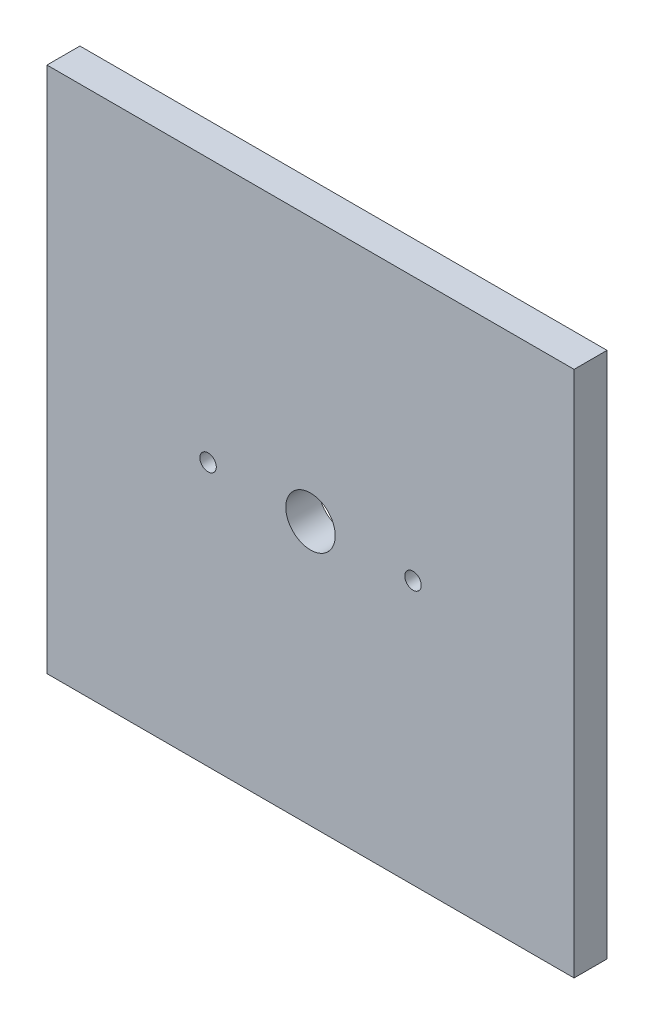
ISO-10303-21;
HEADER;
FILE_DESCRIPTION(('STEP AP214'),'2;1');
FILE_NAME('part.step','',(''),(''),'','','');
FILE_SCHEMA(('AUTOMOTIVE_DESIGN { 1 0 10303 214 1 1 1 1 }'));
ENDSEC;
DATA;
#1=APPLICATION_CONTEXT('core data for automotive mechanical design processes');
#2=APPLICATION_PROTOCOL_DEFINITION('international standard','automotive_design',2000,#1);
#3=PRODUCT_CONTEXT('',#1,'mechanical');
#4=PRODUCT('Part','Part','',(#3));
#5=PRODUCT_RELATED_PRODUCT_CATEGORY('part','',(#4));
#6=PRODUCT_DEFINITION_FORMATION('','',#4);
#7=PRODUCT_DEFINITION_CONTEXT('part definition',#1,'design');
#8=PRODUCT_DEFINITION('design','',#6,#7);
#9=PRODUCT_DEFINITION_SHAPE('','',#8);
#10=(LENGTH_UNIT() NAMED_UNIT(*) SI_UNIT(.MILLI.,.METRE.));
#11=(NAMED_UNIT(*) PLANE_ANGLE_UNIT() SI_UNIT($,.RADIAN.));
#12=(NAMED_UNIT(*) SI_UNIT($,.STERADIAN.) SOLID_ANGLE_UNIT());
#13=UNCERTAINTY_MEASURE_WITH_UNIT(LENGTH_MEASURE(1.E-05),#10,'distance_accuracy_value','');
#14=(GEOMETRIC_REPRESENTATION_CONTEXT(3) GLOBAL_UNCERTAINTY_ASSIGNED_CONTEXT((#13)) GLOBAL_UNIT_ASSIGNED_CONTEXT((#10,
#11,#12)) REPRESENTATION_CONTEXT('',''));
#15=CARTESIAN_POINT('',(0.,0.,0.));
#16=DIRECTION('',(0.,0.,1.));
#17=DIRECTION('',(1.,0.,0.));
#18=AXIS2_PLACEMENT_3D('',#15,#16,#17);
#19=CARTESIAN_POINT('',(101.6,101.6,12.7));
#20=DIRECTION('',(-0.999999999999996,0.,0.));
#21=DIRECTION('',(0.,-0.999999999999996,0.));
#22=AXIS2_PLACEMENT_3D('',#19,#20,#21);
#23=PLANE('',#22);
#24=DIRECTION('',(0.,0.999999999999996,0.));
#25=VECTOR('',#24,1.);
#26=CARTESIAN_POINT('',(101.6,101.6,0.));
#27=LINE('',#26,#25);
#28=CARTESIAN_POINT('',(101.6,-101.6,0.));
#29=VERTEX_POINT('',#28);
#30=CARTESIAN_POINT('',(101.6,101.6,0.));
#31=VERTEX_POINT('',#30);
#32=EDGE_CURVE('E103',#29,#31,#27,.T.);
#33=ORIENTED_EDGE('',*,*,#32,.T.);
#34=DIRECTION('',(0.,0.,-0.999999999999989));
#35=VECTOR('',#34,1.);
#36=CARTESIAN_POINT('',(101.6,101.6,12.7));
#37=LINE('',#36,#35);
#38=CARTESIAN_POINT('',(101.6,101.6,12.7));
#39=VERTEX_POINT('',#38);
#40=EDGE_CURVE('E11',#39,#31,#37,.T.);
#41=ORIENTED_EDGE('',*,*,#40,.F.);
#42=DIRECTION('',(0.,0.999999999999996,0.));
#43=VECTOR('',#42,1.);
#44=CARTESIAN_POINT('',(101.6,101.6,12.7));
#45=LINE('',#44,#43);
#46=CARTESIAN_POINT('',(101.6,-101.6,12.7));
#47=VERTEX_POINT('',#46);
#48=EDGE_CURVE('E91',#47,#39,#45,.T.);
#49=ORIENTED_EDGE('',*,*,#48,.F.);
#50=DIRECTION('',(0.,0.,-0.999999999999989));
#51=VECTOR('',#50,1.);
#52=CARTESIAN_POINT('',(101.6,-101.6,12.7));
#53=LINE('',#52,#51);
#54=EDGE_CURVE('E99',#47,#29,#53,.T.);
#55=ORIENTED_EDGE('',*,*,#54,.T.);
#56=EDGE_LOOP('',(#33,#41,#49,#55));
#57=FACE_BOUND('',#56,.T.);
#58=ADVANCED_FACE('F40',(#57),#23,.F.);
#59=CARTESIAN_POINT('',(-101.6,101.6,12.7000000000001));
#60=DIRECTION('',(0.,-0.999999999999996,0.));
#61=DIRECTION('',(0.,0.,-0.999999999999989));
#62=AXIS2_PLACEMENT_3D('',#59,#60,#61);
#63=PLANE('',#62);
#64=DIRECTION('',(-0.999999999999996,0.,0.));
#65=VECTOR('',#64,1.);
#66=CARTESIAN_POINT('',(-101.6,101.6,7.21644966006352E-13));
#67=LINE('',#66,#65);
#68=CARTESIAN_POINT('',(-101.6,101.6,7.21644966006352E-13));
#69=VERTEX_POINT('',#68);
#70=EDGE_CURVE('E95',#31,#69,#67,.T.);
#71=ORIENTED_EDGE('',*,*,#70,.T.);
#72=DIRECTION('',(0.,0.,-0.999999999999989));
#73=VECTOR('',#72,1.);
#74=CARTESIAN_POINT('',(-101.6,101.6,12.7000000000001));
#75=LINE('',#74,#73);
#76=CARTESIAN_POINT('',(-101.6,101.6,12.7000000000001));
#77=VERTEX_POINT('',#76);
#78=EDGE_CURVE('E48',#77,#69,#75,.T.);
#79=ORIENTED_EDGE('',*,*,#78,.F.);
#80=DIRECTION('',(-0.999999999999996,0.,0.));
#81=VECTOR('',#80,1.);
#82=CARTESIAN_POINT('',(-101.6,101.6,12.7000000000001));
#83=LINE('',#82,#81);
#84=EDGE_CURVE('E86',#39,#77,#83,.T.);
#85=ORIENTED_EDGE('',*,*,#84,.F.);
#86=ORIENTED_EDGE('',*,*,#40,.T.);
#87=EDGE_LOOP('',(#71,#79,#85,#86));
#88=FACE_BOUND('',#87,.T.);
#89=ADVANCED_FACE('F94',(#88),#63,.F.);
#90=CARTESIAN_POINT('',(-101.6,101.6,12.7000000000001));
#91=DIRECTION('',(0.999999999999996,0.,0.));
#92=DIRECTION('',(0.,0.999999999999996,0.));
#93=AXIS2_PLACEMENT_3D('',#90,#91,#92);
#94=PLANE('',#93);
#95=DIRECTION('',(0.,-0.999999999999996,0.));
#96=VECTOR('',#95,1.);
#97=CARTESIAN_POINT('',(-101.6,101.6,7.21644966006352E-13));
#98=LINE('',#97,#96);
#99=CARTESIAN_POINT('',(-101.6,-101.6,2.77555756156289E-13));
#100=VERTEX_POINT('',#99);
#101=EDGE_CURVE('E73',#69,#100,#98,.T.);
#102=ORIENTED_EDGE('',*,*,#101,.T.);
#103=DIRECTION('',(0.,0.,-0.999999999999989));
#104=VECTOR('',#103,1.);
#105=CARTESIAN_POINT('',(-101.6,-101.6,12.7));
#106=LINE('',#105,#104);
#107=CARTESIAN_POINT('',(-101.6,-101.6,12.7));
#108=VERTEX_POINT('',#107);
#109=EDGE_CURVE('E96',#108,#100,#106,.T.);
#110=ORIENTED_EDGE('',*,*,#109,.F.);
#111=DIRECTION('',(0.,-0.999999999999996,0.));
#112=VECTOR('',#111,1.);
#113=CARTESIAN_POINT('',(-101.6,101.6,12.7000000000001));
#114=LINE('',#113,#112);
#115=EDGE_CURVE('E89',#77,#108,#114,.T.);
#116=ORIENTED_EDGE('',*,*,#115,.F.);
#117=ORIENTED_EDGE('',*,*,#78,.T.);
#118=EDGE_LOOP('',(#102,#110,#116,#117));
#119=FACE_BOUND('',#118,.T.);
#120=ADVANCED_FACE('F97',(#119),#94,.F.);
#121=CARTESIAN_POINT('',(-101.6,-101.6,12.7));
#122=DIRECTION('',(0.,0.999999999999996,0.));
#123=DIRECTION('',(0.,0.,0.999999999999989));
#124=AXIS2_PLACEMENT_3D('',#121,#122,#123);
#125=PLANE('',#124);
#126=DIRECTION('',(0.999999999999996,0.,0.));
#127=VECTOR('',#126,1.);
#128=CARTESIAN_POINT('',(-101.6,-101.6,2.77555756156289E-13));
#129=LINE('',#128,#127);
#130=EDGE_CURVE('E79',#100,#29,#129,.T.);
#131=ORIENTED_EDGE('',*,*,#130,.T.);
#132=ORIENTED_EDGE('',*,*,#54,.F.);
#133=DIRECTION('',(0.999999999999996,0.,0.));
#134=VECTOR('',#133,1.);
#135=CARTESIAN_POINT('',(-101.6,-101.6,12.7));
#136=LINE('',#135,#134);
#137=EDGE_CURVE('E56',#108,#47,#136,.T.);
#138=ORIENTED_EDGE('',*,*,#137,.F.);
#139=ORIENTED_EDGE('',*,*,#109,.T.);
#140=EDGE_LOOP('',(#131,#132,#138,#139));
#141=FACE_BOUND('',#140,.T.);
#142=ADVANCED_FACE('F111',(#141),#125,.F.);
#143=CARTESIAN_POINT('',(0.,0.,12.7));
#144=DIRECTION('',(0.,0.,0.999999999999989));
#145=DIRECTION('',(0.999999999999996,0.,0.));
#146=AXIS2_PLACEMENT_3D('',#143,#144,#145);
#147=PLANE('',#146);
#148=CARTESIAN_POINT('',(-39.4969999999999,0.,12.7));
#149=DIRECTION('',(0.,0.,0.999999999999989));
#150=DIRECTION('',(0.999999999999996,0.,0.));
#151=AXIS2_PLACEMENT_3D('',#148,#149,#150);
#152=CIRCLE('',#151,3.175);
#153=CARTESIAN_POINT('',(-36.3219999999999,0.,12.7));
#154=VERTEX_POINT('',#153);
#155=EDGE_CURVE('E123',#154,#154,#152,.T.);
#156=ORIENTED_EDGE('',*,*,#155,.F.);
#157=EDGE_LOOP('',(#156));
#158=FACE_BOUND('',#157,.T.);
#159=CARTESIAN_POINT('',(39.4969999999999,0.,12.7));
#160=DIRECTION('',(0.,0.,0.999999999999989));
#161=DIRECTION('',(0.999999999999996,0.,0.));
#162=AXIS2_PLACEMENT_3D('',#159,#160,#161);
#163=CIRCLE('',#162,3.175);
#164=CARTESIAN_POINT('',(42.6719999999999,0.,12.7));
#165=VERTEX_POINT('',#164);
#166=EDGE_CURVE('E129',#165,#165,#163,.T.);
#167=ORIENTED_EDGE('',*,*,#166,.F.);
#168=EDGE_LOOP('',(#167));
#169=FACE_BOUND('',#168,.T.);
#170=CARTESIAN_POINT('',(0.,0.,12.7));
#171=DIRECTION('',(0.,0.,0.999999999999989));
#172=DIRECTION('',(0.999999999999996,0.,0.));
#173=AXIS2_PLACEMENT_3D('',#170,#171,#172);
#174=CIRCLE('',#173,9.525);
#175=CARTESIAN_POINT('',(9.52499999999996,0.,12.7));
#176=VERTEX_POINT('',#175);
#177=EDGE_CURVE('E117',#176,#176,#174,.T.);
#178=ORIENTED_EDGE('',*,*,#177,.F.);
#179=EDGE_LOOP('',(#178));
#180=FACE_BOUND('',#179,.T.);
#181=ORIENTED_EDGE('',*,*,#48,.T.);
#182=ORIENTED_EDGE('',*,*,#84,.T.);
#183=ORIENTED_EDGE('',*,*,#115,.T.);
#184=ORIENTED_EDGE('',*,*,#137,.T.);
#185=EDGE_LOOP('',(#181,#182,#183,#184));
#186=FACE_BOUND('',#185,.T.);
#187=ADVANCED_FACE('F87',(#158,#169,#180,#186),#147,.T.);
#188=CARTESIAN_POINT('',(0.,0.,0.));
#189=DIRECTION('',(0.,0.,0.999999999999989));
#190=DIRECTION('',(0.999999999999996,0.,0.));
#191=AXIS2_PLACEMENT_3D('',#188,#189,#190);
#192=PLANE('',#191);
#193=CARTESIAN_POINT('',(-39.4969999999999,0.,0.));
#194=DIRECTION('',(0.,0.,0.999999999999989));
#195=DIRECTION('',(0.999999999999996,0.,0.));
#196=AXIS2_PLACEMENT_3D('',#193,#194,#195);
#197=CIRCLE('',#196,3.175);
#198=CARTESIAN_POINT('',(-36.3219999999999,0.,0.));
#199=VERTEX_POINT('',#198);
#200=EDGE_CURVE('E126',#199,#199,#197,.T.);
#201=ORIENTED_EDGE('',*,*,#200,.T.);
#202=EDGE_LOOP('',(#201));
#203=FACE_BOUND('',#202,.T.);
#204=CARTESIAN_POINT('',(39.4969999999999,0.,0.));
#205=DIRECTION('',(0.,0.,0.999999999999989));
#206=DIRECTION('',(0.999999999999996,0.,0.));
#207=AXIS2_PLACEMENT_3D('',#204,#205,#206);
#208=CIRCLE('',#207,3.175);
#209=CARTESIAN_POINT('',(42.6719999999999,0.,0.));
#210=VERTEX_POINT('',#209);
#211=EDGE_CURVE('E120',#210,#210,#208,.T.);
#212=ORIENTED_EDGE('',*,*,#211,.T.);
#213=EDGE_LOOP('',(#212));
#214=FACE_BOUND('',#213,.T.);
#215=CARTESIAN_POINT('',(0.,0.,0.));
#216=DIRECTION('',(0.,0.,0.999999999999989));
#217=DIRECTION('',(0.999999999999996,0.,0.));
#218=AXIS2_PLACEMENT_3D('',#215,#216,#217);
#219=CIRCLE('',#218,9.525);
#220=CARTESIAN_POINT('',(9.52499999999996,0.,0.));
#221=VERTEX_POINT('',#220);
#222=EDGE_CURVE('E106',#221,#221,#219,.T.);
#223=ORIENTED_EDGE('',*,*,#222,.T.);
#224=EDGE_LOOP('',(#223));
#225=FACE_BOUND('',#224,.T.);
#226=ORIENTED_EDGE('',*,*,#32,.F.);
#227=ORIENTED_EDGE('',*,*,#130,.F.);
#228=ORIENTED_EDGE('',*,*,#101,.F.);
#229=ORIENTED_EDGE('',*,*,#70,.F.);
#230=EDGE_LOOP('',(#226,#227,#228,#229));
#231=FACE_BOUND('',#230,.T.);
#232=ADVANCED_FACE('F114',(#203,#214,#225,#231),#192,.F.);
#233=CARTESIAN_POINT('',(0.,0.,0.));
#234=DIRECTION('',(0.,0.,0.999999999999989));
#235=DIRECTION('',(0.999999999999996,0.,0.));
#236=AXIS2_PLACEMENT_3D('',#233,#234,#235);
#237=CYLINDRICAL_SURFACE('',#236,9.525);
#238=CARTESIAN_POINT('',(9.52499999999996,0.,0.));
#239=CARTESIAN_POINT('',(9.52499999999996,0.,0.132291666666667));
#240=CARTESIAN_POINT('',(9.52499999999996,0.,0.264583333333333));
#241=CARTESIAN_POINT('',(9.52499999999996,0.,0.529166666666666));
#242=CARTESIAN_POINT('',(9.52499999999996,0.,0.661458333333333));
#243=CARTESIAN_POINT('',(9.52499999999996,0.,0.926041666666666));
#244=CARTESIAN_POINT('',(9.52499999999996,0.,1.05833333333333));
#245=CARTESIAN_POINT('',(9.52499999999996,0.,1.32291666666667));
#246=CARTESIAN_POINT('',(9.52499999999996,0.,1.45520833333333));
#247=CARTESIAN_POINT('',(9.52499999999996,0.,1.71979166666667));
#248=CARTESIAN_POINT('',(9.52499999999996,0.,1.85208333333333));
#249=CARTESIAN_POINT('',(9.52499999999996,0.,2.11666666666666));
#250=CARTESIAN_POINT('',(9.52499999999996,0.,2.24895833333333));
#251=CARTESIAN_POINT('',(9.52499999999996,0.,2.51354166666667));
#252=CARTESIAN_POINT('',(9.52499999999996,0.,2.64583333333333));
#253=CARTESIAN_POINT('',(9.52499999999996,0.,2.91041666666666));
#254=CARTESIAN_POINT('',(9.52499999999996,0.,3.04270833333333));
#255=CARTESIAN_POINT('',(9.52499999999996,0.,3.30729166666666));
#256=CARTESIAN_POINT('',(9.52499999999996,0.,3.43958333333333));
#257=CARTESIAN_POINT('',(9.52499999999996,0.,3.70416666666666));
#258=CARTESIAN_POINT('',(9.52499999999996,0.,3.83645833333333));
#259=CARTESIAN_POINT('',(9.52499999999996,0.,4.10104166666666));
#260=CARTESIAN_POINT('',(9.52499999999996,0.,4.23333333333333));
#261=CARTESIAN_POINT('',(9.52499999999996,0.,4.49791666666666));
#262=CARTESIAN_POINT('',(9.52499999999996,0.,4.63020833333333));
#263=CARTESIAN_POINT('',(9.52499999999996,0.,4.89479166666666));
#264=CARTESIAN_POINT('',(9.52499999999996,0.,5.02708333333333));
#265=CARTESIAN_POINT('',(9.52499999999996,0.,5.29166666666666));
#266=CARTESIAN_POINT('',(9.52499999999996,0.,5.42395833333333));
#267=CARTESIAN_POINT('',(9.52499999999996,0.,5.68854166666666));
#268=CARTESIAN_POINT('',(9.52499999999996,0.,5.82083333333333));
#269=CARTESIAN_POINT('',(9.52499999999996,0.,6.08541666666666));
#270=CARTESIAN_POINT('',(9.52499999999996,0.,6.21770833333333));
#271=CARTESIAN_POINT('',(9.52499999999996,0.,6.48229166666666));
#272=CARTESIAN_POINT('',(9.52499999999996,0.,6.61458333333333));
#273=CARTESIAN_POINT('',(9.52499999999996,0.,6.87916666666666));
#274=CARTESIAN_POINT('',(9.52499999999996,0.,7.01145833333333));
#275=CARTESIAN_POINT('',(9.52499999999996,0.,7.27604166666666));
#276=CARTESIAN_POINT('',(9.52499999999996,0.,7.40833333333333));
#277=CARTESIAN_POINT('',(9.52499999999996,0.,7.67291666666666));
#278=CARTESIAN_POINT('',(9.52499999999996,0.,7.80520833333333));
#279=CARTESIAN_POINT('',(9.52499999999996,0.,8.06979166666666));
#280=CARTESIAN_POINT('',(9.52499999999996,0.,8.20208333333333));
#281=CARTESIAN_POINT('',(9.52499999999996,0.,8.46666666666666));
#282=CARTESIAN_POINT('',(9.52499999999996,0.,8.59895833333333));
#283=CARTESIAN_POINT('',(9.52499999999996,0.,8.86354166666666));
#284=CARTESIAN_POINT('',(9.52499999999996,0.,8.99583333333333));
#285=CARTESIAN_POINT('',(9.52499999999996,0.,9.26041666666666));
#286=CARTESIAN_POINT('',(9.52499999999996,0.,9.39270833333333));
#287=CARTESIAN_POINT('',(9.52499999999996,0.,9.65729166666666));
#288=CARTESIAN_POINT('',(9.52499999999996,0.,9.78958333333333));
#289=CARTESIAN_POINT('',(9.52499999999996,0.,10.0541666666667));
#290=CARTESIAN_POINT('',(9.52499999999996,0.,10.1864583333333));
#291=CARTESIAN_POINT('',(9.52499999999996,0.,10.4510416666667));
#292=CARTESIAN_POINT('',(9.52499999999996,0.,10.5833333333333));
#293=CARTESIAN_POINT('',(9.52499999999996,0.,10.8479166666667));
#294=CARTESIAN_POINT('',(9.52499999999996,0.,10.9802083333333));
#295=CARTESIAN_POINT('',(9.52499999999996,0.,11.2447916666667));
#296=CARTESIAN_POINT('',(9.52499999999996,0.,11.3770833333333));
#297=CARTESIAN_POINT('',(9.52499999999996,0.,11.6416666666667));
#298=CARTESIAN_POINT('',(9.52499999999996,0.,11.7739583333333));
#299=CARTESIAN_POINT('',(9.52499999999996,0.,12.0385416666667));
#300=CARTESIAN_POINT('',(9.52499999999996,0.,12.1708333333333));
#301=CARTESIAN_POINT('',(9.52499999999996,0.,12.4354166666667));
#302=CARTESIAN_POINT('',(9.52499999999996,0.,12.5677083333333));
#303=CARTESIAN_POINT('',(9.52499999999996,0.,12.7));
#304=B_SPLINE_CURVE_WITH_KNOTS('',3,(#238,#239,#240,#241,#242,#243,#244,#245,#246,#247,#248,
#249,#250,#251,#252,#253,#254,#255,#256,#257,#258,#259,#260,#261,#262,#263,#264,#265,#266,#267,
#268,#269,#270,#271,#272,#273,#274,#275,#276,#277,#278,#279,#280,#281,#282,#283,#284,#285,#286,
#287,#288,#289,#290,#291,#292,#293,#294,#295,#296,#297,#298,#299,#300,#301,#302,#303),
.UNSPECIFIED.,.F.,.F.,(4,2,2,2,2,2,2,2,2,2,2,2,2,2,2,2,2,2,2,2,2,2,2,2,2,2,2,2,2,2,2,2,4),(0.,
0.396875,0.793749999999999,1.190625,1.5875,1.984375,2.38125,2.778125,3.175,3.571875,3.96875,
4.365625,4.7625,5.159375,5.55625,5.953125,6.35,6.74687499999999,7.14374999999999,
7.54062499999999,7.93749999999999,8.33437499999999,8.73124999999999,9.12812499999999,
9.52499999999999,9.92187499999999,10.31875,10.715625,11.1125,11.509375,11.90625,12.303125,12.7),.UNSPECIFIED.);
#305=EDGE_CURVE('BSEAM141',#221,#176,#304,.T.);
#306=ORIENTED_EDGE('',*,*,#222,.F.);
#307=ORIENTED_EDGE('',*,*,#177,.T.);
#308=ORIENTED_EDGE('',*,*,#305,.T.);
#309=ORIENTED_EDGE('',*,*,#305,.F.);
#310=EDGE_LOOP('',(#306,#308,#307,#309));
#311=FACE_BOUND('',#310,.T.);
#312=ADVANCED_FACE('F141',(#311),#237,.F.);
#313=CARTESIAN_POINT('',(39.4969999999999,0.,0.));
#314=DIRECTION('',(0.,0.,0.999999999999989));
#315=DIRECTION('',(0.999999999999996,0.,0.));
#316=AXIS2_PLACEMENT_3D('',#313,#314,#315);
#317=CYLINDRICAL_SURFACE('',#316,3.175);
#318=CARTESIAN_POINT('',(42.6719999999999,0.,0.));
#319=CARTESIAN_POINT('',(42.6719999999999,0.,0.132291666666667));
#320=CARTESIAN_POINT('',(42.6719999999999,0.,0.264583333333333));
#321=CARTESIAN_POINT('',(42.6719999999999,0.,0.529166666666666));
#322=CARTESIAN_POINT('',(42.6719999999999,0.,0.661458333333333));
#323=CARTESIAN_POINT('',(42.6719999999999,0.,0.926041666666666));
#324=CARTESIAN_POINT('',(42.6719999999999,0.,1.05833333333333));
#325=CARTESIAN_POINT('',(42.6719999999999,0.,1.32291666666667));
#326=CARTESIAN_POINT('',(42.6719999999999,0.,1.45520833333333));
#327=CARTESIAN_POINT('',(42.6719999999999,0.,1.71979166666667));
#328=CARTESIAN_POINT('',(42.6719999999999,0.,1.85208333333333));
#329=CARTESIAN_POINT('',(42.6719999999999,0.,2.11666666666666));
#330=CARTESIAN_POINT('',(42.6719999999999,0.,2.24895833333333));
#331=CARTESIAN_POINT('',(42.6719999999999,0.,2.51354166666667));
#332=CARTESIAN_POINT('',(42.6719999999999,0.,2.64583333333333));
#333=CARTESIAN_POINT('',(42.6719999999999,0.,2.91041666666666));
#334=CARTESIAN_POINT('',(42.6719999999999,0.,3.04270833333333));
#335=CARTESIAN_POINT('',(42.6719999999999,0.,3.30729166666666));
#336=CARTESIAN_POINT('',(42.6719999999999,0.,3.43958333333333));
#337=CARTESIAN_POINT('',(42.6719999999999,0.,3.70416666666666));
#338=CARTESIAN_POINT('',(42.6719999999999,0.,3.83645833333333));
#339=CARTESIAN_POINT('',(42.6719999999999,0.,4.10104166666666));
#340=CARTESIAN_POINT('',(42.6719999999999,0.,4.23333333333333));
#341=CARTESIAN_POINT('',(42.6719999999999,0.,4.49791666666666));
#342=CARTESIAN_POINT('',(42.6719999999999,0.,4.63020833333333));
#343=CARTESIAN_POINT('',(42.6719999999999,0.,4.89479166666666));
#344=CARTESIAN_POINT('',(42.6719999999999,0.,5.02708333333333));
#345=CARTESIAN_POINT('',(42.6719999999999,0.,5.29166666666666));
#346=CARTESIAN_POINT('',(42.6719999999999,0.,5.42395833333333));
#347=CARTESIAN_POINT('',(42.6719999999999,0.,5.68854166666666));
#348=CARTESIAN_POINT('',(42.6719999999999,0.,5.82083333333333));
#349=CARTESIAN_POINT('',(42.6719999999999,0.,6.08541666666666));
#350=CARTESIAN_POINT('',(42.6719999999999,0.,6.21770833333333));
#351=CARTESIAN_POINT('',(42.6719999999999,0.,6.48229166666666));
#352=CARTESIAN_POINT('',(42.6719999999999,0.,6.61458333333333));
#353=CARTESIAN_POINT('',(42.6719999999999,0.,6.87916666666666));
#354=CARTESIAN_POINT('',(42.6719999999999,0.,7.01145833333333));
#355=CARTESIAN_POINT('',(42.6719999999999,0.,7.27604166666666));
#356=CARTESIAN_POINT('',(42.6719999999999,0.,7.40833333333333));
#357=CARTESIAN_POINT('',(42.6719999999999,0.,7.67291666666666));
#358=CARTESIAN_POINT('',(42.6719999999999,0.,7.80520833333333));
#359=CARTESIAN_POINT('',(42.6719999999999,0.,8.06979166666666));
#360=CARTESIAN_POINT('',(42.6719999999999,0.,8.20208333333333));
#361=CARTESIAN_POINT('',(42.6719999999999,0.,8.46666666666666));
#362=CARTESIAN_POINT('',(42.6719999999999,0.,8.59895833333333));
#363=CARTESIAN_POINT('',(42.6719999999999,0.,8.86354166666666));
#364=CARTESIAN_POINT('',(42.6719999999999,0.,8.99583333333333));
#365=CARTESIAN_POINT('',(42.6719999999999,0.,9.26041666666666));
#366=CARTESIAN_POINT('',(42.6719999999999,0.,9.39270833333333));
#367=CARTESIAN_POINT('',(42.6719999999999,0.,9.65729166666666));
#368=CARTESIAN_POINT('',(42.6719999999999,0.,9.78958333333333));
#369=CARTESIAN_POINT('',(42.6719999999999,0.,10.0541666666667));
#370=CARTESIAN_POINT('',(42.6719999999999,0.,10.1864583333333));
#371=CARTESIAN_POINT('',(42.6719999999999,0.,10.4510416666667));
#372=CARTESIAN_POINT('',(42.6719999999999,0.,10.5833333333333));
#373=CARTESIAN_POINT('',(42.6719999999999,0.,10.8479166666667));
#374=CARTESIAN_POINT('',(42.6719999999999,0.,10.9802083333333));
#375=CARTESIAN_POINT('',(42.6719999999999,0.,11.2447916666667));
#376=CARTESIAN_POINT('',(42.6719999999999,0.,11.3770833333333));
#377=CARTESIAN_POINT('',(42.6719999999999,0.,11.6416666666667));
#378=CARTESIAN_POINT('',(42.6719999999999,0.,11.7739583333333));
#379=CARTESIAN_POINT('',(42.6719999999999,0.,12.0385416666667));
#380=CARTESIAN_POINT('',(42.6719999999999,0.,12.1708333333333));
#381=CARTESIAN_POINT('',(42.6719999999999,0.,12.4354166666667));
#382=CARTESIAN_POINT('',(42.6719999999999,0.,12.5677083333333));
#383=CARTESIAN_POINT('',(42.6719999999999,0.,12.7));
#384=B_SPLINE_CURVE_WITH_KNOTS('',3,(#318,#319,#320,#321,#322,#323,#324,#325,#326,#327,#328,
#329,#330,#331,#332,#333,#334,#335,#336,#337,#338,#339,#340,#341,#342,#343,#344,#345,#346,#347,
#348,#349,#350,#351,#352,#353,#354,#355,#356,#357,#358,#359,#360,#361,#362,#363,#364,#365,#366,
#367,#368,#369,#370,#371,#372,#373,#374,#375,#376,#377,#378,#379,#380,#381,#382,#383),
.UNSPECIFIED.,.F.,.F.,(4,2,2,2,2,2,2,2,2,2,2,2,2,2,2,2,2,2,2,2,2,2,2,2,2,2,2,2,2,2,2,2,4),(0.,
0.396875,0.793749999999999,1.190625,1.5875,1.984375,2.38125,2.778125,3.175,3.571875,3.96875,
4.365625,4.7625,5.159375,5.55625,5.953125,6.35,6.74687499999999,7.14374999999999,
7.54062499999999,7.93749999999999,8.33437499999999,8.73124999999999,9.12812499999999,
9.52499999999999,9.92187499999999,10.31875,10.715625,11.1125,11.509375,11.90625,12.303125,12.7),.UNSPECIFIED.);
#385=EDGE_CURVE('BSEAM137',#210,#165,#384,.T.);
#386=ORIENTED_EDGE('',*,*,#211,.F.);
#387=ORIENTED_EDGE('',*,*,#166,.T.);
#388=ORIENTED_EDGE('',*,*,#385,.T.);
#389=ORIENTED_EDGE('',*,*,#385,.F.);
#390=EDGE_LOOP('',(#386,#388,#387,#389));
#391=FACE_BOUND('',#390,.T.);
#392=ADVANCED_FACE('F137',(#391),#317,.F.);
#393=CARTESIAN_POINT('',(-39.4969999999999,0.,0.));
#394=DIRECTION('',(0.,0.,0.999999999999989));
#395=DIRECTION('',(0.999999999999996,0.,0.));
#396=AXIS2_PLACEMENT_3D('',#393,#394,#395);
#397=CYLINDRICAL_SURFACE('',#396,3.175);
#398=CARTESIAN_POINT('',(-36.3219999999999,0.,0.));
#399=CARTESIAN_POINT('',(-36.3219999999999,0.,0.132291666666667));
#400=CARTESIAN_POINT('',(-36.3219999999999,0.,0.264583333333333));
#401=CARTESIAN_POINT('',(-36.3219999999999,0.,0.529166666666666));
#402=CARTESIAN_POINT('',(-36.3219999999999,0.,0.661458333333333));
#403=CARTESIAN_POINT('',(-36.3219999999999,0.,0.926041666666666));
#404=CARTESIAN_POINT('',(-36.3219999999999,0.,1.05833333333333));
#405=CARTESIAN_POINT('',(-36.3219999999999,0.,1.32291666666667));
#406=CARTESIAN_POINT('',(-36.3219999999999,0.,1.45520833333333));
#407=CARTESIAN_POINT('',(-36.3219999999999,0.,1.71979166666667));
#408=CARTESIAN_POINT('',(-36.3219999999999,0.,1.85208333333333));
#409=CARTESIAN_POINT('',(-36.3219999999999,0.,2.11666666666666));
#410=CARTESIAN_POINT('',(-36.3219999999999,0.,2.24895833333333));
#411=CARTESIAN_POINT('',(-36.3219999999999,0.,2.51354166666667));
#412=CARTESIAN_POINT('',(-36.3219999999999,0.,2.64583333333333));
#413=CARTESIAN_POINT('',(-36.3219999999999,0.,2.91041666666666));
#414=CARTESIAN_POINT('',(-36.3219999999999,0.,3.04270833333333));
#415=CARTESIAN_POINT('',(-36.3219999999999,0.,3.30729166666666));
#416=CARTESIAN_POINT('',(-36.3219999999999,0.,3.43958333333333));
#417=CARTESIAN_POINT('',(-36.3219999999999,0.,3.70416666666666));
#418=CARTESIAN_POINT('',(-36.3219999999999,0.,3.83645833333333));
#419=CARTESIAN_POINT('',(-36.3219999999999,0.,4.10104166666666));
#420=CARTESIAN_POINT('',(-36.3219999999999,0.,4.23333333333333));
#421=CARTESIAN_POINT('',(-36.3219999999999,0.,4.49791666666666));
#422=CARTESIAN_POINT('',(-36.3219999999999,0.,4.63020833333333));
#423=CARTESIAN_POINT('',(-36.3219999999999,0.,4.89479166666666));
#424=CARTESIAN_POINT('',(-36.3219999999999,0.,5.02708333333333));
#425=CARTESIAN_POINT('',(-36.3219999999999,0.,5.29166666666666));
#426=CARTESIAN_POINT('',(-36.3219999999999,0.,5.42395833333333));
#427=CARTESIAN_POINT('',(-36.3219999999999,0.,5.68854166666666));
#428=CARTESIAN_POINT('',(-36.3219999999999,0.,5.82083333333333));
#429=CARTESIAN_POINT('',(-36.3219999999999,0.,6.08541666666666));
#430=CARTESIAN_POINT('',(-36.3219999999999,0.,6.21770833333333));
#431=CARTESIAN_POINT('',(-36.3219999999999,0.,6.48229166666666));
#432=CARTESIAN_POINT('',(-36.3219999999999,0.,6.61458333333333));
#433=CARTESIAN_POINT('',(-36.3219999999999,0.,6.87916666666666));
#434=CARTESIAN_POINT('',(-36.3219999999999,0.,7.01145833333333));
#435=CARTESIAN_POINT('',(-36.3219999999999,0.,7.27604166666666));
#436=CARTESIAN_POINT('',(-36.3219999999999,0.,7.40833333333333));
#437=CARTESIAN_POINT('',(-36.3219999999999,0.,7.67291666666666));
#438=CARTESIAN_POINT('',(-36.3219999999999,0.,7.80520833333333));
#439=CARTESIAN_POINT('',(-36.3219999999999,0.,8.06979166666666));
#440=CARTESIAN_POINT('',(-36.3219999999999,0.,8.20208333333333));
#441=CARTESIAN_POINT('',(-36.3219999999999,0.,8.46666666666666));
#442=CARTESIAN_POINT('',(-36.3219999999999,0.,8.59895833333333));
#443=CARTESIAN_POINT('',(-36.3219999999999,0.,8.86354166666666));
#444=CARTESIAN_POINT('',(-36.3219999999999,0.,8.99583333333333));
#445=CARTESIAN_POINT('',(-36.3219999999999,0.,9.26041666666666));
#446=CARTESIAN_POINT('',(-36.3219999999999,0.,9.39270833333333));
#447=CARTESIAN_POINT('',(-36.3219999999999,0.,9.65729166666666));
#448=CARTESIAN_POINT('',(-36.3219999999999,0.,9.78958333333333));
#449=CARTESIAN_POINT('',(-36.3219999999999,0.,10.0541666666667));
#450=CARTESIAN_POINT('',(-36.3219999999999,0.,10.1864583333333));
#451=CARTESIAN_POINT('',(-36.3219999999999,0.,10.4510416666667));
#452=CARTESIAN_POINT('',(-36.3219999999999,0.,10.5833333333333));
#453=CARTESIAN_POINT('',(-36.3219999999999,0.,10.8479166666667));
#454=CARTESIAN_POINT('',(-36.3219999999999,0.,10.9802083333333));
#455=CARTESIAN_POINT('',(-36.3219999999999,0.,11.2447916666667));
#456=CARTESIAN_POINT('',(-36.3219999999999,0.,11.3770833333333));
#457=CARTESIAN_POINT('',(-36.3219999999999,0.,11.6416666666667));
#458=CARTESIAN_POINT('',(-36.3219999999999,0.,11.7739583333333));
#459=CARTESIAN_POINT('',(-36.3219999999999,0.,12.0385416666667));
#460=CARTESIAN_POINT('',(-36.3219999999999,0.,12.1708333333333));
#461=CARTESIAN_POINT('',(-36.3219999999999,0.,12.4354166666667));
#462=CARTESIAN_POINT('',(-36.3219999999999,0.,12.5677083333333));
#463=CARTESIAN_POINT('',(-36.3219999999999,0.,12.7));
#464=B_SPLINE_CURVE_WITH_KNOTS('',3,(#398,#399,#400,#401,#402,#403,#404,#405,#406,#407,#408,
#409,#410,#411,#412,#413,#414,#415,#416,#417,#418,#419,#420,#421,#422,#423,#424,#425,#426,#427,
#428,#429,#430,#431,#432,#433,#434,#435,#436,#437,#438,#439,#440,#441,#442,#443,#444,#445,#446,
#447,#448,#449,#450,#451,#452,#453,#454,#455,#456,#457,#458,#459,#460,#461,#462,#463),
.UNSPECIFIED.,.F.,.F.,(4,2,2,2,2,2,2,2,2,2,2,2,2,2,2,2,2,2,2,2,2,2,2,2,2,2,2,2,2,2,2,2,4),(0.,
0.396875,0.793749999999999,1.190625,1.5875,1.984375,2.38125,2.778125,3.175,3.571875,3.96875,
4.365625,4.7625,5.159375,5.55625,5.953125,6.35,6.74687499999999,7.14374999999999,
7.54062499999999,7.93749999999999,8.33437499999999,8.73124999999999,9.12812499999999,
9.52499999999999,9.92187499999999,10.31875,10.715625,11.1125,11.509375,11.90625,12.303125,12.7),.UNSPECIFIED.);
#465=EDGE_CURVE('BSEAM140',#199,#154,#464,.T.);
#466=ORIENTED_EDGE('',*,*,#200,.F.);
#467=ORIENTED_EDGE('',*,*,#155,.T.);
#468=ORIENTED_EDGE('',*,*,#465,.T.);
#469=ORIENTED_EDGE('',*,*,#465,.F.);
#470=EDGE_LOOP('',(#466,#468,#467,#469));
#471=FACE_BOUND('',#470,.T.);
#472=ADVANCED_FACE('F140',(#471),#397,.F.);
#473=CLOSED_SHELL('',(#58,#89,#120,#142,#187,#232,#312,#392,#472));
#474=MANIFOLD_SOLID_BREP('B2',#473);
#475=ADVANCED_BREP_SHAPE_REPRESENTATION('',(#18,#474),#14);
#476=SHAPE_DEFINITION_REPRESENTATION(#9,#475);
ENDSEC;
END-ISO-10303-21;
